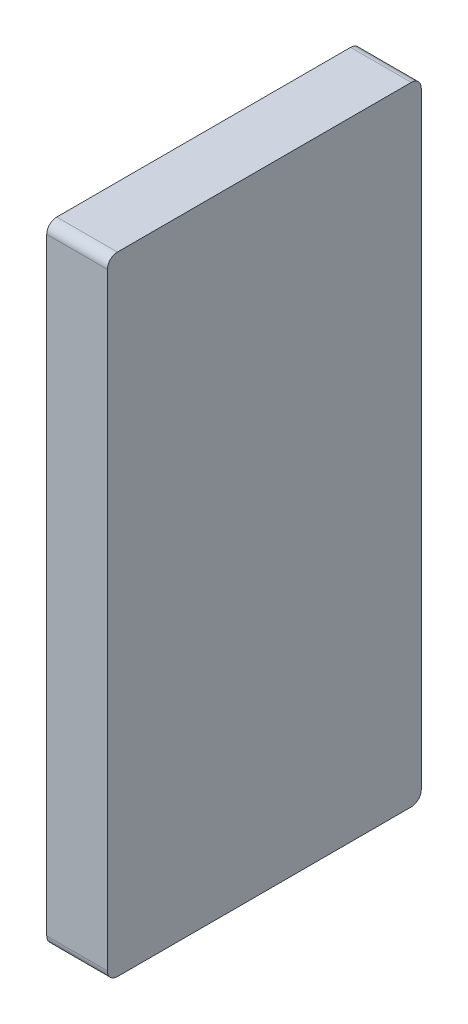
ISO-10303-21;
HEADER;
FILE_DESCRIPTION(('STEP AP214'),'2;1');
FILE_NAME('part.step','',(''),(''),'','','');
FILE_SCHEMA(('AUTOMOTIVE_DESIGN { 1 0 10303 214 1 1 1 1 }'));
ENDSEC;
DATA;
#1=APPLICATION_CONTEXT('core data for automotive mechanical design processes');
#2=APPLICATION_PROTOCOL_DEFINITION('international standard','automotive_design',2000,#1);
#3=PRODUCT_CONTEXT('',#1,'mechanical');
#4=PRODUCT('Part','Part','',(#3));
#5=PRODUCT_RELATED_PRODUCT_CATEGORY('part','',(#4));
#6=PRODUCT_DEFINITION_FORMATION('','',#4);
#7=PRODUCT_DEFINITION_CONTEXT('part definition',#1,'design');
#8=PRODUCT_DEFINITION('design','',#6,#7);
#9=PRODUCT_DEFINITION_SHAPE('','',#8);
#10=(LENGTH_UNIT() NAMED_UNIT(*) SI_UNIT(.MILLI.,.METRE.));
#11=(NAMED_UNIT(*) PLANE_ANGLE_UNIT() SI_UNIT($,.RADIAN.));
#12=(NAMED_UNIT(*) SI_UNIT($,.STERADIAN.) SOLID_ANGLE_UNIT());
#13=UNCERTAINTY_MEASURE_WITH_UNIT(LENGTH_MEASURE(1.E-05),#10,'distance_accuracy_value','');
#14=(GEOMETRIC_REPRESENTATION_CONTEXT(3) GLOBAL_UNCERTAINTY_ASSIGNED_CONTEXT((#13)) GLOBAL_UNIT_ASSIGNED_CONTEXT((#10,
#11,#12)) REPRESENTATION_CONTEXT('',''));
#15=CARTESIAN_POINT('',(0.,0.,0.));
#16=DIRECTION('',(0.,0.,1.));
#17=DIRECTION('',(1.,0.,0.));
#18=AXIS2_PLACEMENT_3D('',#15,#16,#17);
#19=CARTESIAN_POINT('',(0.499999999999999,1.52,0.55));
#20=DIRECTION('',(-1.,0.,0.));
#21=DIRECTION('',(0.,0.707106781186548,-0.707106781186548));
#22=AXIS2_PLACEMENT_3D('',#19,#20,#21);
#23=CYLINDRICAL_SURFACE('',#22,0.05);
#24=CARTESIAN_POINT('',(0.696340390353669,1.52,0.55));
#25=DIRECTION('',(1.,0.,0.));
#26=DIRECTION('',(0.,0.707106781186548,-0.707106781186548));
#27=AXIS2_PLACEMENT_3D('',#24,#25,#26);
#28=CIRCLE('',#27,0.05);
#29=CARTESIAN_POINT('',(0.696340390353669,1.52,0.5));
#30=VERTEX_POINT('',#29);
#31=CARTESIAN_POINT('',(0.696340390353669,1.57,0.55));
#32=VERTEX_POINT('',#31);
#33=EDGE_CURVE('E11',#30,#32,#28,.T.);
#34=ORIENTED_EDGE('',*,*,#33,.T.);
#35=DIRECTION('',(1.,0.,0.));
#36=VECTOR('',#35,1.);
#37=CARTESIAN_POINT('',(0.499999999999999,1.57,0.55));
#38=LINE('',#37,#36);
#39=CARTESIAN_POINT('',(1.,1.57,0.55));
#40=VERTEX_POINT('',#39);
#41=EDGE_CURVE('E24',#32,#40,#38,.T.);
#42=ORIENTED_EDGE('',*,*,#41,.T.);
#43=CARTESIAN_POINT('',(0.999999999999999,1.52,0.55));
#44=DIRECTION('',(-1.,0.,0.));
#45=DIRECTION('',(0.,0.707106781186548,-0.707106781186548));
#46=AXIS2_PLACEMENT_3D('',#43,#44,#45);
#47=CIRCLE('',#46,0.05);
#48=CARTESIAN_POINT('',(1.,1.52,0.5));
#49=VERTEX_POINT('',#48);
#50=EDGE_CURVE('E145',#40,#49,#47,.T.);
#51=ORIENTED_EDGE('',*,*,#50,.T.);
#52=DIRECTION('',(-1.,0.,0.));
#53=VECTOR('',#52,1.);
#54=CARTESIAN_POINT('',(0.499999999999999,1.52,0.5));
#55=LINE('',#54,#53);
#56=EDGE_CURVE('E143',#49,#30,#55,.T.);
#57=ORIENTED_EDGE('',*,*,#56,.T.);
#58=EDGE_LOOP('',(#34,#42,#51,#57));
#59=FACE_BOUND('',#58,.T.);
#60=ADVANCED_FACE('F17',(#59),#23,.T.);
#61=CARTESIAN_POINT('',(1.,0.,2.070501516009));
#62=DIRECTION('',(1.,0.,0.));
#63=DIRECTION('',(0.,0.,-1.));
#64=AXIS2_PLACEMENT_3D('',#61,#62,#63);
#65=PLANE('',#64);
#66=ORIENTED_EDGE('',*,*,#50,.F.);
#67=DIRECTION('',(0.,0.,-1.));
#68=VECTOR('',#67,1.);
#69=CARTESIAN_POINT('',(1.,1.57,0.5));
#70=LINE('',#69,#68);
#71=CARTESIAN_POINT('',(1.,1.57,2.020501516009));
#72=VERTEX_POINT('',#71);
#73=EDGE_CURVE('E140',#72,#40,#70,.T.);
#74=ORIENTED_EDGE('',*,*,#73,.F.);
#75=CARTESIAN_POINT('',(1.,1.52,2.020501516009));
#76=DIRECTION('',(-1.,0.,0.));
#77=DIRECTION('',(0.,0.707106781186548,0.707106781186548));
#78=AXIS2_PLACEMENT_3D('',#75,#76,#77);
#79=CIRCLE('',#78,0.05);
#80=CARTESIAN_POINT('',(1.,1.52,2.070501516009));
#81=VERTEX_POINT('',#80);
#82=EDGE_CURVE('E137',#81,#72,#79,.T.);
#83=ORIENTED_EDGE('',*,*,#82,.F.);
#84=DIRECTION('',(0.,1.,0.));
#85=VECTOR('',#84,1.);
#86=CARTESIAN_POINT('',(1.,0.,2.070501516009));
#87=LINE('',#86,#85);
#88=CARTESIAN_POINT('',(1.,-1.52,2.070501516009));
#89=VERTEX_POINT('',#88);
#90=EDGE_CURVE('E135',#89,#81,#87,.T.);
#91=ORIENTED_EDGE('',*,*,#90,.F.);
#92=CARTESIAN_POINT('',(1.,-1.52,2.020501516009));
#93=DIRECTION('',(-1.,0.,0.));
#94=DIRECTION('',(0.,-0.707106781186548,0.707106781186548));
#95=AXIS2_PLACEMENT_3D('',#92,#93,#94);
#96=CIRCLE('',#95,0.05);
#97=CARTESIAN_POINT('',(1.,-1.57,2.020501516009));
#98=VERTEX_POINT('',#97);
#99=EDGE_CURVE('E94',#98,#89,#96,.T.);
#100=ORIENTED_EDGE('',*,*,#99,.F.);
#101=DIRECTION('',(0.,0.,1.));
#102=VECTOR('',#101,1.);
#103=CARTESIAN_POINT('',(1.,-1.57,0.5));
#104=LINE('',#103,#102);
#105=CARTESIAN_POINT('',(1.,-1.57,0.55));
#106=VERTEX_POINT('',#105);
#107=EDGE_CURVE('E131',#106,#98,#104,.T.);
#108=ORIENTED_EDGE('',*,*,#107,.F.);
#109=CARTESIAN_POINT('',(0.999999999999999,-1.52,0.55));
#110=DIRECTION('',(-1.,0.,0.));
#111=DIRECTION('',(0.,-0.707106781186548,-0.707106781186548));
#112=AXIS2_PLACEMENT_3D('',#109,#110,#111);
#113=CIRCLE('',#112,0.05);
#114=CARTESIAN_POINT('',(1.,-1.52,0.5));
#115=VERTEX_POINT('',#114);
#116=EDGE_CURVE('E128',#115,#106,#113,.T.);
#117=ORIENTED_EDGE('',*,*,#116,.F.);
#118=DIRECTION('',(0.,-1.,0.));
#119=VECTOR('',#118,1.);
#120=CARTESIAN_POINT('',(1.,0.,0.5));
#121=LINE('',#120,#119);
#122=EDGE_CURVE('E125',#49,#115,#121,.T.);
#123=ORIENTED_EDGE('',*,*,#122,.F.);
#124=EDGE_LOOP('',(#66,#74,#83,#91,#100,#108,#117,#123));
#125=FACE_BOUND('',#124,.T.);
#126=ADVANCED_FACE('F151',(#125),#65,.T.);
#127=CARTESIAN_POINT('',(0.,1.57,1.285250758004));
#128=DIRECTION('',(0.,1.,0.));
#129=DIRECTION('',(0.,0.,1.));
#130=AXIS2_PLACEMENT_3D('',#127,#128,#129);
#131=PLANE('',#130);
#132=ORIENTED_EDGE('',*,*,#41,.F.);
#133=DIRECTION('',(0.,0.,1.));
#134=VECTOR('',#133,1.);
#135=CARTESIAN_POINT('',(0.696340390353669,1.57,1.686623828138));
#136=LINE('',#135,#134);
#137=CARTESIAN_POINT('',(0.696340390353669,1.57,2.020501516009));
#138=VERTEX_POINT('',#137);
#139=EDGE_CURVE('E123',#32,#138,#136,.T.);
#140=ORIENTED_EDGE('',*,*,#139,.T.);
#141=DIRECTION('',(-1.,0.,0.));
#142=VECTOR('',#141,1.);
#143=CARTESIAN_POINT('',(-0.500000000000001,1.57,2.020501516009));
#144=LINE('',#143,#142);
#145=EDGE_CURVE('E120',#72,#138,#144,.T.);
#146=ORIENTED_EDGE('',*,*,#145,.F.);
#147=ORIENTED_EDGE('',*,*,#73,.T.);
#148=EDGE_LOOP('',(#132,#140,#146,#147));
#149=FACE_BOUND('',#148,.T.);
#150=ADVANCED_FACE('F153',(#149),#131,.T.);
#151=CARTESIAN_POINT('',(-0.500000000000001,1.52,2.020501516009));
#152=DIRECTION('',(1.,0.,0.));
#153=DIRECTION('',(0.,0.707106781186548,0.707106781186548));
#154=AXIS2_PLACEMENT_3D('',#151,#152,#153);
#155=CYLINDRICAL_SURFACE('',#154,0.05);
#156=ORIENTED_EDGE('',*,*,#82,.T.);
#157=ORIENTED_EDGE('',*,*,#145,.T.);
#158=CARTESIAN_POINT('',(0.696340390353669,1.52,2.020501516009));
#159=DIRECTION('',(1.,0.,0.));
#160=DIRECTION('',(0.,0.707106781186548,0.707106781186548));
#161=AXIS2_PLACEMENT_3D('',#158,#159,#160);
#162=CIRCLE('',#161,0.05);
#163=CARTESIAN_POINT('',(0.696340390353669,1.52,2.070501516009));
#164=VERTEX_POINT('',#163);
#165=EDGE_CURVE('E118',#138,#164,#162,.T.);
#166=ORIENTED_EDGE('',*,*,#165,.T.);
#167=DIRECTION('',(1.,0.,0.));
#168=VECTOR('',#167,1.);
#169=CARTESIAN_POINT('',(-0.500000000000001,1.52,2.070501516009));
#170=LINE('',#169,#168);
#171=EDGE_CURVE('E101',#164,#81,#170,.T.);
#172=ORIENTED_EDGE('',*,*,#171,.T.);
#173=EDGE_LOOP('',(#156,#157,#166,#172));
#174=FACE_BOUND('',#173,.T.);
#175=ADVANCED_FACE('F155',(#174),#155,.T.);
#176=CARTESIAN_POINT('',(0.499999999999999,-1.52,0.55));
#177=DIRECTION('',(1.,0.,0.));
#178=DIRECTION('',(0.,-0.707106781186548,-0.707106781186548));
#179=AXIS2_PLACEMENT_3D('',#176,#177,#178);
#180=CYLINDRICAL_SURFACE('',#179,0.05);
#181=ORIENTED_EDGE('',*,*,#116,.T.);
#182=DIRECTION('',(-1.,0.,0.));
#183=VECTOR('',#182,1.);
#184=CARTESIAN_POINT('',(0.499999999999999,-1.57,0.55));
#185=LINE('',#184,#183);
#186=CARTESIAN_POINT('',(0.696340390353669,-1.57,0.55));
#187=VERTEX_POINT('',#186);
#188=EDGE_CURVE('E115',#106,#187,#185,.T.);
#189=ORIENTED_EDGE('',*,*,#188,.T.);
#190=CARTESIAN_POINT('',(0.696340390353669,-1.52,0.55));
#191=DIRECTION('',(1.,0.,0.));
#192=DIRECTION('',(0.,-0.707106781186548,-0.707106781186548));
#193=AXIS2_PLACEMENT_3D('',#190,#191,#192);
#194=CIRCLE('',#193,0.05);
#195=CARTESIAN_POINT('',(0.696340390353669,-1.52,0.5));
#196=VERTEX_POINT('',#195);
#197=EDGE_CURVE('E113',#187,#196,#194,.T.);
#198=ORIENTED_EDGE('',*,*,#197,.T.);
#199=DIRECTION('',(1.,0.,0.));
#200=VECTOR('',#199,1.);
#201=CARTESIAN_POINT('',(0.499999999999999,-1.52,0.5));
#202=LINE('',#201,#200);
#203=EDGE_CURVE('E110',#196,#115,#202,.T.);
#204=ORIENTED_EDGE('',*,*,#203,.T.);
#205=EDGE_LOOP('',(#181,#189,#198,#204));
#206=FACE_BOUND('',#205,.T.);
#207=ADVANCED_FACE('F160',(#206),#180,.T.);
#208=CARTESIAN_POINT('',(0.,-1.57,1.285250758004));
#209=DIRECTION('',(0.,-1.,0.));
#210=DIRECTION('',(0.,0.,-1.));
#211=AXIS2_PLACEMENT_3D('',#208,#209,#210);
#212=PLANE('',#211);
#213=ORIENTED_EDGE('',*,*,#188,.F.);
#214=ORIENTED_EDGE('',*,*,#107,.T.);
#215=DIRECTION('',(1.,0.,0.));
#216=VECTOR('',#215,1.);
#217=CARTESIAN_POINT('',(-0.500000000000001,-1.57,2.020501516009));
#218=LINE('',#217,#216);
#219=CARTESIAN_POINT('',(0.696340390353669,-1.57,2.020501516009));
#220=VERTEX_POINT('',#219);
#221=EDGE_CURVE('E108',#220,#98,#218,.T.);
#222=ORIENTED_EDGE('',*,*,#221,.F.);
#223=DIRECTION('',(0.,0.,-1.));
#224=VECTOR('',#223,1.);
#225=CARTESIAN_POINT('',(0.696340390353669,-1.57,1.686623828138));
#226=LINE('',#225,#224);
#227=EDGE_CURVE('E86',#220,#187,#226,.T.);
#228=ORIENTED_EDGE('',*,*,#227,.T.);
#229=EDGE_LOOP('',(#213,#214,#222,#228));
#230=FACE_BOUND('',#229,.T.);
#231=ADVANCED_FACE('F158',(#230),#212,.T.);
#232=CARTESIAN_POINT('',(-0.500000000000001,-1.52,2.020501516009));
#233=DIRECTION('',(-1.,0.,0.));
#234=DIRECTION('',(0.,-0.707106781186548,0.707106781186548));
#235=AXIS2_PLACEMENT_3D('',#232,#233,#234);
#236=CYLINDRICAL_SURFACE('',#235,0.05);
#237=CARTESIAN_POINT('',(0.696340390353669,-1.52,2.020501516009));
#238=DIRECTION('',(1.,0.,0.));
#239=DIRECTION('',(0.,-0.707106781186548,0.707106781186548));
#240=AXIS2_PLACEMENT_3D('',#237,#238,#239);
#241=CIRCLE('',#240,0.05);
#242=CARTESIAN_POINT('',(0.696340390353669,-1.52,2.070501516009));
#243=VERTEX_POINT('',#242);
#244=EDGE_CURVE('E78',#243,#220,#241,.T.);
#245=ORIENTED_EDGE('',*,*,#244,.T.);
#246=ORIENTED_EDGE('',*,*,#221,.T.);
#247=ORIENTED_EDGE('',*,*,#99,.T.);
#248=DIRECTION('',(-1.,0.,0.));
#249=VECTOR('',#248,1.);
#250=CARTESIAN_POINT('',(-0.500000000000001,-1.52,2.070501516009));
#251=LINE('',#250,#249);
#252=EDGE_CURVE('E89',#89,#243,#251,.T.);
#253=ORIENTED_EDGE('',*,*,#252,.T.);
#254=EDGE_LOOP('',(#245,#246,#247,#253));
#255=FACE_BOUND('',#254,.T.);
#256=ADVANCED_FACE('F93',(#255),#236,.T.);
#257=CARTESIAN_POINT('',(-1.,0.,2.070501516009));
#258=DIRECTION('',(0.,0.,1.));
#259=DIRECTION('',(1.,0.,0.));
#260=AXIS2_PLACEMENT_3D('',#257,#258,#259);
#261=PLANE('',#260);
#262=ORIENTED_EDGE('',*,*,#171,.F.);
#263=DIRECTION('',(0.,-1.,0.));
#264=VECTOR('',#263,1.);
#265=CARTESIAN_POINT('',(0.696340390353669,-0.8,2.070501516009));
#266=LINE('',#265,#264);
#267=EDGE_CURVE('E83',#164,#243,#266,.T.);
#268=ORIENTED_EDGE('',*,*,#267,.T.);
#269=ORIENTED_EDGE('',*,*,#252,.F.);
#270=ORIENTED_EDGE('',*,*,#90,.T.);
#271=EDGE_LOOP('',(#262,#268,#269,#270));
#272=FACE_BOUND('',#271,.T.);
#273=ADVANCED_FACE('F99',(#272),#261,.T.);
#274=CARTESIAN_POINT('',(1.,0.,0.5));
#275=DIRECTION('',(0.,0.,-1.));
#276=DIRECTION('',(-1.,0.,0.));
#277=AXIS2_PLACEMENT_3D('',#274,#275,#276);
#278=PLANE('',#277);
#279=ORIENTED_EDGE('',*,*,#56,.F.);
#280=ORIENTED_EDGE('',*,*,#122,.T.);
#281=ORIENTED_EDGE('',*,*,#203,.F.);
#282=DIRECTION('',(0.,1.,0.));
#283=VECTOR('',#282,1.);
#284=CARTESIAN_POINT('',(0.696340390353669,-0.8,0.5));
#285=LINE('',#284,#283);
#286=EDGE_CURVE('E102',#196,#30,#285,.T.);
#287=ORIENTED_EDGE('',*,*,#286,.T.);
#288=EDGE_LOOP('',(#279,#280,#281,#287));
#289=FACE_BOUND('',#288,.T.);
#290=ADVANCED_FACE('F163',(#289),#278,.T.);
#291=CARTESIAN_POINT('',(0.696340390353669,-1.6,2.087996898271));
#292=DIRECTION('',(1.,0.,0.));
#293=DIRECTION('',(0.,0.,-1.));
#294=AXIS2_PLACEMENT_3D('',#291,#292,#293);
#295=PLANE('',#294);
#296=ORIENTED_EDGE('',*,*,#33,.F.);
#297=ORIENTED_EDGE('',*,*,#286,.F.);
#298=ORIENTED_EDGE('',*,*,#197,.F.);
#299=ORIENTED_EDGE('',*,*,#227,.F.);
#300=ORIENTED_EDGE('',*,*,#244,.F.);
#301=ORIENTED_EDGE('',*,*,#267,.F.);
#302=ORIENTED_EDGE('',*,*,#165,.F.);
#303=ORIENTED_EDGE('',*,*,#139,.F.);
#304=EDGE_LOOP('',(#296,#297,#298,#299,#300,#301,#302,#303));
#305=FACE_BOUND('',#304,.T.);
#306=ADVANCED_FACE('F80',(#305),#295,.F.);
#307=CLOSED_SHELL('',(#60,#126,#150,#175,#207,#231,#256,#273,#290,#306));
#308=MANIFOLD_SOLID_BREP('B1',#307);
#309=ADVANCED_BREP_SHAPE_REPRESENTATION('',(#18,#308),#14);
#310=SHAPE_DEFINITION_REPRESENTATION(#9,#309);
ENDSEC;
END-ISO-10303-21;
